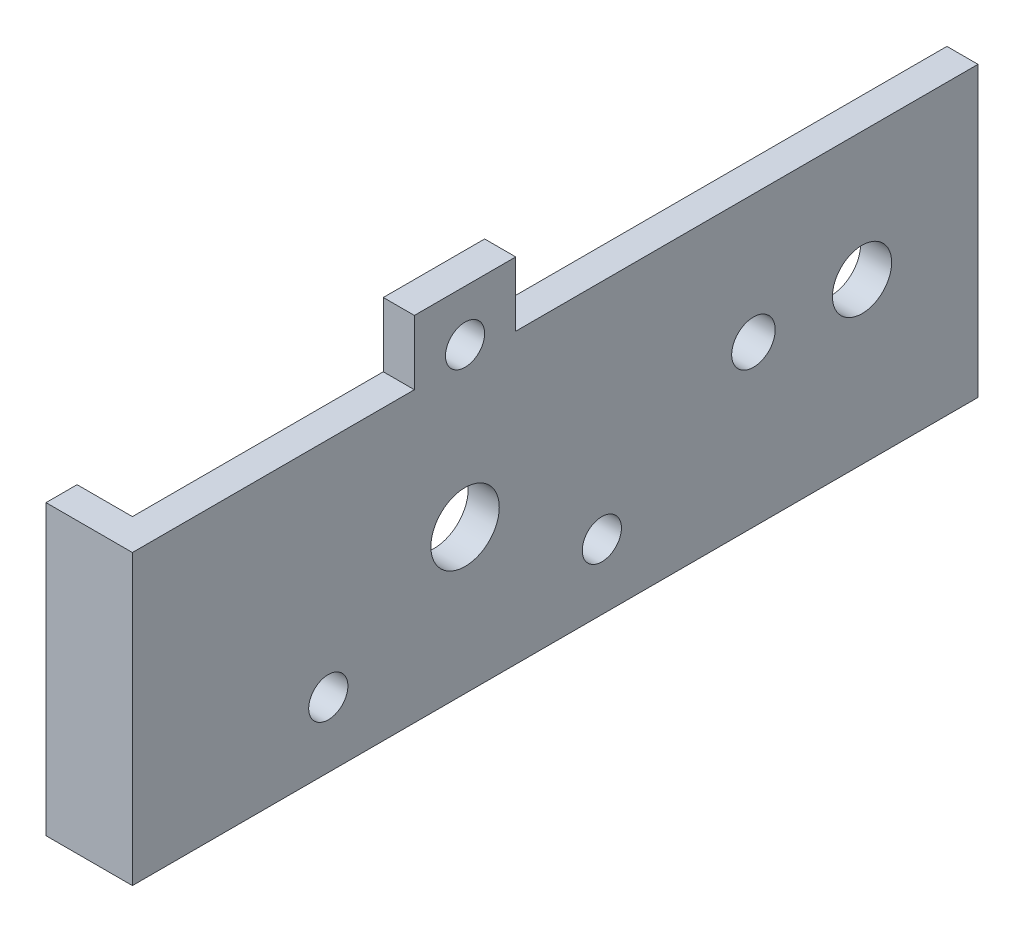
ISO-10303-21;
HEADER;
FILE_DESCRIPTION(('STEP AP214'),'2;1');
FILE_NAME('part.step','',(''),(''),'','','');
FILE_SCHEMA(('AUTOMOTIVE_DESIGN { 1 0 10303 214 1 1 1 1 }'));
ENDSEC;
DATA;
#1=APPLICATION_CONTEXT('core data for automotive mechanical design processes');
#2=APPLICATION_PROTOCOL_DEFINITION('international standard','automotive_design',2000,#1);
#3=PRODUCT_CONTEXT('',#1,'mechanical');
#4=PRODUCT('Part','Part','',(#3));
#5=PRODUCT_RELATED_PRODUCT_CATEGORY('part','',(#4));
#6=PRODUCT_DEFINITION_FORMATION('','',#4);
#7=PRODUCT_DEFINITION_CONTEXT('part definition',#1,'design');
#8=PRODUCT_DEFINITION('design','',#6,#7);
#9=PRODUCT_DEFINITION_SHAPE('','',#8);
#10=(LENGTH_UNIT() NAMED_UNIT(*) SI_UNIT(.MILLI.,.METRE.));
#11=(NAMED_UNIT(*) PLANE_ANGLE_UNIT() SI_UNIT($,.RADIAN.));
#12=(NAMED_UNIT(*) SI_UNIT($,.STERADIAN.) SOLID_ANGLE_UNIT());
#13=UNCERTAINTY_MEASURE_WITH_UNIT(LENGTH_MEASURE(1.E-05),#10,'distance_accuracy_value','');
#14=(GEOMETRIC_REPRESENTATION_CONTEXT(3) GLOBAL_UNCERTAINTY_ASSIGNED_CONTEXT((#13)) GLOBAL_UNIT_ASSIGNED_CONTEXT((#10,
#11,#12)) REPRESENTATION_CONTEXT('',''));
#15=CARTESIAN_POINT('',(0.,0.,0.));
#16=DIRECTION('',(0.,0.,1.));
#17=DIRECTION('',(1.,0.,0.));
#18=AXIS2_PLACEMENT_3D('',#15,#16,#17);
#19=CARTESIAN_POINT('',(13.9,70.2,-63.));
#20=DIRECTION('',(0.,-1.,0.));
#21=DIRECTION('',(0.,0.,-1.));
#22=AXIS2_PLACEMENT_3D('',#19,#20,#21);
#23=PLANE('',#22);
#24=DIRECTION('',(1.,0.,0.));
#25=VECTOR('',#24,1.);
#26=CARTESIAN_POINT('',(8.89999999999996,70.2,-108.35));
#27=LINE('',#26,#25);
#28=CARTESIAN_POINT('',(8.89999999999996,70.2,-108.35));
#29=VERTEX_POINT('',#28);
#30=CARTESIAN_POINT('',(13.9,70.2,-108.35));
#31=VERTEX_POINT('',#30);
#32=EDGE_CURVE('E215',#29,#31,#27,.T.);
#33=ORIENTED_EDGE('',*,*,#32,.F.);
#34=DIRECTION('',(0.,0.,1.));
#35=VECTOR('',#34,1.);
#36=CARTESIAN_POINT('',(8.9,70.2,-199.));
#37=LINE('',#36,#35);
#38=CARTESIAN_POINT('',(8.9,70.2,-68.));
#39=VERTEX_POINT('',#38);
#40=EDGE_CURVE('E238',#29,#39,#37,.T.);
#41=ORIENTED_EDGE('',*,*,#40,.T.);
#42=DIRECTION('',(-1.,0.,0.));
#43=VECTOR('',#42,1.);
#44=CARTESIAN_POINT('',(13.9,70.2,-68.));
#45=LINE('',#44,#43);
#46=CARTESIAN_POINT('',(0.,70.2,-68.));
#47=VERTEX_POINT('',#46);
#48=EDGE_CURVE('E269',#39,#47,#45,.T.);
#49=ORIENTED_EDGE('',*,*,#48,.T.);
#50=DIRECTION('',(0.,0.,1.));
#51=VECTOR('',#50,1.);
#52=CARTESIAN_POINT('',(0.,70.2,-63.));
#53=LINE('',#52,#51);
#54=CARTESIAN_POINT('',(0.,70.2,-63.));
#55=VERTEX_POINT('',#54);
#56=EDGE_CURVE('E251',#47,#55,#53,.T.);
#57=ORIENTED_EDGE('',*,*,#56,.T.);
#58=DIRECTION('',(-1.,0.,0.));
#59=VECTOR('',#58,1.);
#60=CARTESIAN_POINT('',(13.9,70.2,-63.));
#61=LINE('',#60,#59);
#62=CARTESIAN_POINT('',(13.9,70.2,-63.));
#63=VERTEX_POINT('',#62);
#64=EDGE_CURVE('E257',#63,#55,#61,.T.);
#65=ORIENTED_EDGE('',*,*,#64,.F.);
#66=DIRECTION('',(0.,0.,1.));
#67=VECTOR('',#66,1.);
#68=CARTESIAN_POINT('',(13.9,70.2,-63.));
#69=LINE('',#68,#67);
#70=EDGE_CURVE('E253',#31,#63,#69,.T.);
#71=ORIENTED_EDGE('',*,*,#70,.F.);
#72=EDGE_LOOP('',(#33,#41,#49,#57,#65,#71));
#73=FACE_BOUND('',#72,.T.);
#74=ADVANCED_FACE('F40',(#73),#23,.F.);
#75=CARTESIAN_POINT('',(13.9,70.2,-68.));
#76=DIRECTION('',(0.,0.,1.));
#77=DIRECTION('',(1.,0.,0.));
#78=AXIS2_PLACEMENT_3D('',#75,#76,#77);
#79=PLANE('',#78);
#80=DIRECTION('',(0.,1.,0.));
#81=VECTOR('',#80,1.);
#82=CARTESIAN_POINT('',(8.9,70.2,-68.));
#83=LINE('',#82,#81);
#84=CARTESIAN_POINT('',(8.9,23.8,-68.));
#85=VERTEX_POINT('',#84);
#86=EDGE_CURVE('E65',#85,#39,#83,.T.);
#87=ORIENTED_EDGE('',*,*,#86,.F.);
#88=DIRECTION('',(-1.,0.,0.));
#89=VECTOR('',#88,1.);
#90=CARTESIAN_POINT('',(13.9,23.8,-68.));
#91=LINE('',#90,#89);
#92=CARTESIAN_POINT('',(0.,23.8,-68.));
#93=VERTEX_POINT('',#92);
#94=EDGE_CURVE('E49',#85,#93,#91,.T.);
#95=ORIENTED_EDGE('',*,*,#94,.T.);
#96=DIRECTION('',(0.,1.,0.));
#97=VECTOR('',#96,1.);
#98=CARTESIAN_POINT('',(0.,70.2,-68.));
#99=LINE('',#98,#97);
#100=EDGE_CURVE('E263',#93,#47,#99,.T.);
#101=ORIENTED_EDGE('',*,*,#100,.T.);
#102=ORIENTED_EDGE('',*,*,#48,.F.);
#103=EDGE_LOOP('',(#87,#95,#101,#102));
#104=FACE_BOUND('',#103,.T.);
#105=ADVANCED_FACE('F295',(#104),#79,.F.);
#106=CARTESIAN_POINT('',(13.9,23.8,-63.));
#107=DIRECTION('',(0.,0.,-1.));
#108=DIRECTION('',(-1.,0.,0.));
#109=AXIS2_PLACEMENT_3D('',#106,#107,#108);
#110=PLANE('',#109);
#111=DIRECTION('',(0.,-1.,0.));
#112=VECTOR('',#111,1.);
#113=CARTESIAN_POINT('',(0.,23.8,-63.));
#114=LINE('',#113,#112);
#115=CARTESIAN_POINT('',(0.,23.8,-63.));
#116=VERTEX_POINT('',#115);
#117=EDGE_CURVE('E246',#55,#116,#114,.T.);
#118=ORIENTED_EDGE('',*,*,#117,.T.);
#119=DIRECTION('',(-1.,0.,0.));
#120=VECTOR('',#119,1.);
#121=CARTESIAN_POINT('',(13.9,23.8,-63.));
#122=LINE('',#121,#120);
#123=CARTESIAN_POINT('',(13.9,23.8,-63.));
#124=VERTEX_POINT('',#123);
#125=EDGE_CURVE('E11',#124,#116,#122,.T.);
#126=ORIENTED_EDGE('',*,*,#125,.F.);
#127=DIRECTION('',(0.,-1.,0.));
#128=VECTOR('',#127,1.);
#129=CARTESIAN_POINT('',(13.9,23.8,-63.));
#130=LINE('',#129,#128);
#131=EDGE_CURVE('E247',#63,#124,#130,.T.);
#132=ORIENTED_EDGE('',*,*,#131,.F.);
#133=ORIENTED_EDGE('',*,*,#64,.T.);
#134=EDGE_LOOP('',(#118,#126,#132,#133));
#135=FACE_BOUND('',#134,.T.);
#136=ADVANCED_FACE('F42',(#135),#110,.F.);
#137=CARTESIAN_POINT('',(13.9,23.8,-68.));
#138=DIRECTION('',(0.,1.,0.));
#139=DIRECTION('',(0.,0.,1.));
#140=AXIS2_PLACEMENT_3D('',#137,#138,#139);
#141=PLANE('',#140);
#142=DIRECTION('',(0.,0.,-1.));
#143=VECTOR('',#142,1.);
#144=CARTESIAN_POINT('',(0.,23.8,-68.));
#145=LINE('',#144,#143);
#146=EDGE_CURVE('E260',#116,#93,#145,.T.);
#147=ORIENTED_EDGE('',*,*,#146,.T.);
#148=ORIENTED_EDGE('',*,*,#94,.F.);
#149=DIRECTION('',(0.,0.,1.));
#150=VECTOR('',#149,1.);
#151=CARTESIAN_POINT('',(8.9,23.8,-199.));
#152=LINE('',#151,#150);
#153=CARTESIAN_POINT('',(8.9,23.8,-199.));
#154=VERTEX_POINT('',#153);
#155=EDGE_CURVE('E243',#154,#85,#152,.T.);
#156=ORIENTED_EDGE('',*,*,#155,.F.);
#157=DIRECTION('',(-1.,0.,0.));
#158=VECTOR('',#157,1.);
#159=CARTESIAN_POINT('',(13.9,23.8,-199.));
#160=LINE('',#159,#158);
#161=CARTESIAN_POINT('',(13.9,23.8,-199.));
#162=VERTEX_POINT('',#161);
#163=EDGE_CURVE('E231',#162,#154,#160,.T.);
#164=ORIENTED_EDGE('',*,*,#163,.F.);
#165=DIRECTION('',(0.,0.,-1.));
#166=VECTOR('',#165,1.);
#167=CARTESIAN_POINT('',(13.9,23.8,-68.));
#168=LINE('',#167,#166);
#169=EDGE_CURVE('E250',#124,#162,#168,.T.);
#170=ORIENTED_EDGE('',*,*,#169,.F.);
#171=ORIENTED_EDGE('',*,*,#125,.T.);
#172=EDGE_LOOP('',(#147,#148,#156,#164,#170,#171));
#173=FACE_BOUND('',#172,.T.);
#174=ADVANCED_FACE('F307',(#173),#141,.F.);
#175=CARTESIAN_POINT('',(8.9,70.2,-199.));
#176=VERTEX_POINT('',#175);
#177=CARTESIAN_POINT('',(8.89999999999995,70.2,-124.65));
#178=VERTEX_POINT('',#177);
#179=EDGE_CURVE('E240',#176,#178,#37,.T.);
#180=ORIENTED_EDGE('',*,*,#179,.T.);
#181=DIRECTION('',(1.,0.,0.));
#182=VECTOR('',#181,1.);
#183=CARTESIAN_POINT('',(8.89999999999995,70.2,-124.65));
#184=LINE('',#183,#182);
#185=CARTESIAN_POINT('',(13.9,70.2,-124.65));
#186=VERTEX_POINT('',#185);
#187=EDGE_CURVE('E225',#178,#186,#184,.T.);
#188=ORIENTED_EDGE('',*,*,#187,.T.);
#189=CARTESIAN_POINT('',(13.9,70.2,-199.));
#190=VERTEX_POINT('',#189);
#191=EDGE_CURVE('E254',#190,#186,#69,.T.);
#192=ORIENTED_EDGE('',*,*,#191,.F.);
#193=DIRECTION('',(1.,0.,0.));
#194=VECTOR('',#193,1.);
#195=CARTESIAN_POINT('',(13.9,70.2,-199.));
#196=LINE('',#195,#194);
#197=EDGE_CURVE('E235',#176,#190,#196,.T.);
#198=ORIENTED_EDGE('',*,*,#197,.F.);
#199=EDGE_LOOP('',(#180,#188,#192,#198));
#200=FACE_BOUND('',#199,.T.);
#201=ADVANCED_FACE('F298',(#200),#23,.F.);
#202=CARTESIAN_POINT('',(13.9,0.,0.));
#203=DIRECTION('',(-1.,0.,0.));
#204=DIRECTION('',(0.,0.,1.));
#205=AXIS2_PLACEMENT_3D('',#202,#203,#204);
#206=PLANE('',#205);
#207=CARTESIAN_POINT('',(13.8999999999999,49.5624999999999,-162.886026441855));
#208=DIRECTION('',(1.,0.,0.));
#209=DIRECTION('',(0.,0.,-1.));
#210=AXIS2_PLACEMENT_3D('',#207,#208,#209);
#211=CIRCLE('',#210,3.49999999999999);
#212=CARTESIAN_POINT('',(13.8999999999999,49.5624999999999,-166.386026441855));
#213=VERTEX_POINT('',#212);
#214=EDGE_CURVE('E174',#213,#213,#211,.T.);
#215=ORIENTED_EDGE('',*,*,#214,.F.);
#216=EDGE_LOOP('',(#215));
#217=FACE_BOUND('',#216,.T.);
#218=CARTESIAN_POINT('',(13.8999999999999,49.5625,-180.348526441855));
#219=DIRECTION('',(1.,0.,0.));
#220=DIRECTION('',(0.,0.,-1.));
#221=AXIS2_PLACEMENT_3D('',#218,#219,#220);
#222=CIRCLE('',#221,4.76250000000001);
#223=CARTESIAN_POINT('',(13.8999999999999,49.5625,-185.111026441855));
#224=VERTEX_POINT('',#223);
#225=EDGE_CURVE('E177',#224,#224,#222,.T.);
#226=ORIENTED_EDGE('',*,*,#225,.F.);
#227=EDGE_LOOP('',(#226));
#228=FACE_BOUND('',#227,.T.);
#229=CARTESIAN_POINT('',(13.9,34.3,-94.5029547438753));
#230=DIRECTION('',(1.,0.,0.));
#231=DIRECTION('',(0.,0.,-1.));
#232=AXIS2_PLACEMENT_3D('',#229,#230,#231);
#233=CIRCLE('',#232,3.14999999999998);
#234=CARTESIAN_POINT('',(13.9,34.3,-97.6529547438752));
#235=VERTEX_POINT('',#234);
#236=EDGE_CURVE('E197',#235,#235,#233,.T.);
#237=ORIENTED_EDGE('',*,*,#236,.F.);
#238=EDGE_LOOP('',(#237));
#239=FACE_BOUND('',#238,.T.);
#240=CARTESIAN_POINT('',(13.8999999999999,34.3,-138.497045256125));
#241=DIRECTION('',(1.,0.,0.));
#242=DIRECTION('',(0.,0.,-1.));
#243=AXIS2_PLACEMENT_3D('',#240,#241,#242);
#244=CIRCLE('',#243,3.14999999999998);
#245=CARTESIAN_POINT('',(13.8999999999999,34.3,-141.647045256125));
#246=VERTEX_POINT('',#245);
#247=EDGE_CURVE('E191',#246,#246,#244,.T.);
#248=ORIENTED_EDGE('',*,*,#247,.F.);
#249=EDGE_LOOP('',(#248));
#250=FACE_BOUND('',#249,.T.);
#251=CARTESIAN_POINT('',(13.9,72.4,-116.5));
#252=DIRECTION('',(1.,0.,0.));
#253=DIRECTION('',(0.,0.,-1.));
#254=AXIS2_PLACEMENT_3D('',#251,#252,#253);
#255=CIRCLE('',#254,3.14999999999999);
#256=CARTESIAN_POINT('',(13.9,72.4,-119.65));
#257=VERTEX_POINT('',#256);
#258=EDGE_CURVE('E185',#257,#257,#255,.T.);
#259=ORIENTED_EDGE('',*,*,#258,.F.);
#260=EDGE_LOOP('',(#259));
#261=FACE_BOUND('',#260,.T.);
#262=CARTESIAN_POINT('',(13.9,47.,-116.5));
#263=DIRECTION('',(1.,0.,0.));
#264=DIRECTION('',(0.,0.,-1.));
#265=AXIS2_PLACEMENT_3D('',#262,#263,#264);
#266=CIRCLE('',#265,5.50000000000002);
#267=CARTESIAN_POINT('',(13.9,47.,-122.));
#268=VERTEX_POINT('',#267);
#269=EDGE_CURVE('E184',#268,#268,#266,.T.);
#270=ORIENTED_EDGE('',*,*,#269,.F.);
#271=EDGE_LOOP('',(#270));
#272=FACE_BOUND('',#271,.T.);
#273=ORIENTED_EDGE('',*,*,#131,.T.);
#274=ORIENTED_EDGE('',*,*,#169,.T.);
#275=DIRECTION('',(0.,-1.,0.));
#276=VECTOR('',#275,1.);
#277=CARTESIAN_POINT('',(13.9,70.2,-199.));
#278=LINE('',#277,#276);
#279=EDGE_CURVE('E228',#190,#162,#278,.T.);
#280=ORIENTED_EDGE('',*,*,#279,.F.);
#281=ORIENTED_EDGE('',*,*,#191,.T.);
#282=DIRECTION('',(0.,1.,0.));
#283=VECTOR('',#282,1.);
#284=CARTESIAN_POINT('',(13.9,70.2,-124.65));
#285=LINE('',#284,#283);
#286=CARTESIAN_POINT('',(13.9,80.55,-124.65));
#287=VERTEX_POINT('',#286);
#288=EDGE_CURVE('E57',#186,#287,#285,.T.);
#289=ORIENTED_EDGE('',*,*,#288,.T.);
#290=DIRECTION('',(0.,0.,1.));
#291=VECTOR('',#290,1.);
#292=CARTESIAN_POINT('',(13.9,80.55,-124.65));
#293=LINE('',#292,#291);
#294=CARTESIAN_POINT('',(13.9,80.55,-108.35));
#295=VERTEX_POINT('',#294);
#296=EDGE_CURVE('E209',#287,#295,#293,.T.);
#297=ORIENTED_EDGE('',*,*,#296,.T.);
#298=DIRECTION('',(0.,-1.,0.));
#299=VECTOR('',#298,1.);
#300=CARTESIAN_POINT('',(13.9,80.55,-108.35));
#301=LINE('',#300,#299);
#302=EDGE_CURVE('E203',#295,#31,#301,.T.);
#303=ORIENTED_EDGE('',*,*,#302,.T.);
#304=ORIENTED_EDGE('',*,*,#70,.T.);
#305=EDGE_LOOP('',(#273,#274,#280,#281,#289,#297,#303,#304));
#306=FACE_BOUND('',#305,.T.);
#307=ADVANCED_FACE('F306',(#217,#228,#239,#250,#261,#272,#306),#206,.F.);
#308=CARTESIAN_POINT('',(0.,0.,0.));
#309=DIRECTION('',(-1.,0.,0.));
#310=DIRECTION('',(0.,0.,1.));
#311=AXIS2_PLACEMENT_3D('',#308,#309,#310);
#312=PLANE('',#311);
#313=CARTESIAN_POINT('',(0.,62.,-65.5));
#314=DIRECTION('',(-1.,0.,0.));
#315=DIRECTION('',(0.,0.,1.));
#316=AXIS2_PLACEMENT_3D('',#313,#314,#315);
#317=CIRCLE('',#316,1.27500000000001);
#318=CARTESIAN_POINT('',(0.,62.,-64.225));
#319=VERTEX_POINT('',#318);
#320=EDGE_CURVE('E147',#319,#319,#317,.T.);
#321=ORIENTED_EDGE('',*,*,#320,.F.);
#322=EDGE_LOOP('',(#321));
#323=FACE_BOUND('',#322,.T.);
#324=CARTESIAN_POINT('',(0.,52.,-65.5));
#325=DIRECTION('',(-1.,0.,0.));
#326=DIRECTION('',(0.,0.,1.));
#327=AXIS2_PLACEMENT_3D('',#324,#325,#326);
#328=CIRCLE('',#327,1.275);
#329=CARTESIAN_POINT('',(0.,52.,-64.225));
#330=VERTEX_POINT('',#329);
#331=EDGE_CURVE('E140',#330,#330,#328,.T.);
#332=ORIENTED_EDGE('',*,*,#331,.F.);
#333=EDGE_LOOP('',(#332));
#334=FACE_BOUND('',#333,.T.);
#335=CARTESIAN_POINT('',(0.,32.,-65.5));
#336=DIRECTION('',(-1.,0.,0.));
#337=DIRECTION('',(0.,0.,1.));
#338=AXIS2_PLACEMENT_3D('',#335,#336,#337);
#339=CIRCLE('',#338,1.275);
#340=CARTESIAN_POINT('',(0.,32.,-64.225));
#341=VERTEX_POINT('',#340);
#342=EDGE_CURVE('E156',#341,#341,#339,.T.);
#343=ORIENTED_EDGE('',*,*,#342,.F.);
#344=EDGE_LOOP('',(#343));
#345=FACE_BOUND('',#344,.T.);
#346=CARTESIAN_POINT('',(0.,42.,-65.5));
#347=DIRECTION('',(-1.,0.,0.));
#348=DIRECTION('',(0.,0.,1.));
#349=AXIS2_PLACEMENT_3D('',#346,#347,#348);
#350=CIRCLE('',#349,1.275);
#351=CARTESIAN_POINT('',(0.,42.,-64.225));
#352=VERTEX_POINT('',#351);
#353=EDGE_CURVE('E165',#352,#352,#350,.T.);
#354=ORIENTED_EDGE('',*,*,#353,.F.);
#355=EDGE_LOOP('',(#354));
#356=FACE_BOUND('',#355,.T.);
#357=ORIENTED_EDGE('',*,*,#117,.F.);
#358=ORIENTED_EDGE('',*,*,#56,.F.);
#359=ORIENTED_EDGE('',*,*,#100,.F.);
#360=ORIENTED_EDGE('',*,*,#146,.F.);
#361=EDGE_LOOP('',(#357,#358,#359,#360));
#362=FACE_BOUND('',#361,.T.);
#363=ADVANCED_FACE('F313',(#323,#334,#345,#356,#362),#312,.T.);
#364=CARTESIAN_POINT('',(8.9,70.2,-199.));
#365=DIRECTION('',(1.,0.,0.));
#366=DIRECTION('',(0.,1.,0.));
#367=AXIS2_PLACEMENT_3D('',#364,#365,#366);
#368=PLANE('',#367);
#369=CARTESIAN_POINT('',(8.9,49.5624999999999,-162.886026441855));
#370=DIRECTION('',(1.,0.,0.));
#371=DIRECTION('',(0.,1.,0.));
#372=AXIS2_PLACEMENT_3D('',#369,#370,#371);
#373=CIRCLE('',#372,3.49999999999999);
#374=CARTESIAN_POINT('',(8.9,53.0624999999998,-162.886026441855));
#375=VERTEX_POINT('',#374);
#376=EDGE_CURVE('E44',#375,#375,#373,.T.);
#377=ORIENTED_EDGE('',*,*,#376,.T.);
#378=EDGE_LOOP('',(#377));
#379=FACE_BOUND('',#378,.T.);
#380=CARTESIAN_POINT('',(8.9,49.5625,-180.348526441855));
#381=DIRECTION('',(1.,0.,0.));
#382=DIRECTION('',(0.,1.,0.));
#383=AXIS2_PLACEMENT_3D('',#380,#381,#382);
#384=CIRCLE('',#383,4.76250000000001);
#385=CARTESIAN_POINT('',(8.9,54.325,-180.348526441855));
#386=VERTEX_POINT('',#385);
#387=EDGE_CURVE('E180',#386,#386,#384,.T.);
#388=ORIENTED_EDGE('',*,*,#387,.T.);
#389=EDGE_LOOP('',(#388));
#390=FACE_BOUND('',#389,.T.);
#391=CARTESIAN_POINT('',(8.89999999999996,34.3,-94.5029547438753));
#392=DIRECTION('',(1.,0.,0.));
#393=DIRECTION('',(0.,0.,-1.));
#394=AXIS2_PLACEMENT_3D('',#391,#392,#393);
#395=CIRCLE('',#394,3.14999999999998);
#396=CARTESIAN_POINT('',(8.89999999999996,34.3,-97.6529547438752));
#397=VERTEX_POINT('',#396);
#398=EDGE_CURVE('E194',#397,#397,#395,.T.);
#399=ORIENTED_EDGE('',*,*,#398,.T.);
#400=EDGE_LOOP('',(#399));
#401=FACE_BOUND('',#400,.T.);
#402=CARTESIAN_POINT('',(8.89999999999995,34.3,-138.497045256125));
#403=DIRECTION('',(1.,0.,0.));
#404=DIRECTION('',(0.,0.,-1.));
#405=AXIS2_PLACEMENT_3D('',#402,#403,#404);
#406=CIRCLE('',#405,3.14999999999998);
#407=CARTESIAN_POINT('',(8.89999999999995,34.3,-141.647045256125));
#408=VERTEX_POINT('',#407);
#409=EDGE_CURVE('E188',#408,#408,#406,.T.);
#410=ORIENTED_EDGE('',*,*,#409,.T.);
#411=EDGE_LOOP('',(#410));
#412=FACE_BOUND('',#411,.T.);
#413=CARTESIAN_POINT('',(8.89999999999996,72.4,-116.5));
#414=DIRECTION('',(1.,0.,0.));
#415=DIRECTION('',(0.,0.,-1.));
#416=AXIS2_PLACEMENT_3D('',#413,#414,#415);
#417=CIRCLE('',#416,3.14999999999999);
#418=CARTESIAN_POINT('',(8.89999999999995,72.4,-119.65));
#419=VERTEX_POINT('',#418);
#420=EDGE_CURVE('E181',#419,#419,#417,.T.);
#421=ORIENTED_EDGE('',*,*,#420,.T.);
#422=EDGE_LOOP('',(#421));
#423=FACE_BOUND('',#422,.T.);
#424=CARTESIAN_POINT('',(8.89999999999996,47.,-116.5));
#425=DIRECTION('',(1.,0.,0.));
#426=DIRECTION('',(0.,0.,-1.));
#427=AXIS2_PLACEMENT_3D('',#424,#425,#426);
#428=CIRCLE('',#427,5.50000000000002);
#429=CARTESIAN_POINT('',(8.89999999999995,47.,-122.));
#430=VERTEX_POINT('',#429);
#431=EDGE_CURVE('E200',#430,#430,#428,.T.);
#432=ORIENTED_EDGE('',*,*,#431,.T.);
#433=EDGE_LOOP('',(#432));
#434=FACE_BOUND('',#433,.T.);
#435=ORIENTED_EDGE('',*,*,#86,.T.);
#436=ORIENTED_EDGE('',*,*,#40,.F.);
#437=DIRECTION('',(0.,-1.,0.));
#438=VECTOR('',#437,1.);
#439=CARTESIAN_POINT('',(8.89999999999996,80.55,-108.35));
#440=LINE('',#439,#438);
#441=CARTESIAN_POINT('',(8.89999999999996,80.55,-108.35));
#442=VERTEX_POINT('',#441);
#443=EDGE_CURVE('E206',#442,#29,#440,.T.);
#444=ORIENTED_EDGE('',*,*,#443,.F.);
#445=DIRECTION('',(0.,0.,1.));
#446=VECTOR('',#445,1.);
#447=CARTESIAN_POINT('',(8.89999999999995,80.55,-124.65));
#448=LINE('',#447,#446);
#449=CARTESIAN_POINT('',(8.89999999999995,80.55,-124.65));
#450=VERTEX_POINT('',#449);
#451=EDGE_CURVE('E212',#450,#442,#448,.T.);
#452=ORIENTED_EDGE('',*,*,#451,.F.);
#453=DIRECTION('',(0.,1.,0.));
#454=VECTOR('',#453,1.);
#455=CARTESIAN_POINT('',(8.89999999999995,70.2,-124.65));
#456=LINE('',#455,#454);
#457=EDGE_CURVE('E208',#178,#450,#456,.T.);
#458=ORIENTED_EDGE('',*,*,#457,.F.);
#459=ORIENTED_EDGE('',*,*,#179,.F.);
#460=DIRECTION('',(0.,1.,0.));
#461=VECTOR('',#460,1.);
#462=CARTESIAN_POINT('',(8.9,70.2,-199.));
#463=LINE('',#462,#461);
#464=EDGE_CURVE('E233',#154,#176,#463,.T.);
#465=ORIENTED_EDGE('',*,*,#464,.F.);
#466=ORIENTED_EDGE('',*,*,#155,.T.);
#467=EDGE_LOOP('',(#435,#436,#444,#452,#458,#459,#465,#466));
#468=FACE_BOUND('',#467,.T.);
#469=ADVANCED_FACE('F274',(#379,#390,#401,#412,#423,#434,#468),#368,.F.);
#470=CARTESIAN_POINT('',(0.,0.,-199.));
#471=DIRECTION('',(0.,0.,-1.));
#472=DIRECTION('',(-1.,0.,0.));
#473=AXIS2_PLACEMENT_3D('',#470,#471,#472);
#474=PLANE('',#473);
#475=ORIENTED_EDGE('',*,*,#279,.T.);
#476=ORIENTED_EDGE('',*,*,#163,.T.);
#477=ORIENTED_EDGE('',*,*,#464,.T.);
#478=ORIENTED_EDGE('',*,*,#197,.T.);
#479=EDGE_LOOP('',(#475,#476,#477,#478));
#480=FACE_BOUND('',#479,.T.);
#481=ADVANCED_FACE('F344',(#480),#474,.T.);
#482=CARTESIAN_POINT('',(8.89999999999996,80.55,-108.35));
#483=DIRECTION('',(0.,0.,1.));
#484=DIRECTION('',(1.,0.,0.));
#485=AXIS2_PLACEMENT_3D('',#482,#483,#484);
#486=PLANE('',#485);
#487=ORIENTED_EDGE('',*,*,#302,.F.);
#488=DIRECTION('',(1.,0.,0.));
#489=VECTOR('',#488,1.);
#490=CARTESIAN_POINT('',(8.89999999999996,80.55,-108.35));
#491=LINE('',#490,#489);
#492=EDGE_CURVE('E221',#442,#295,#491,.T.);
#493=ORIENTED_EDGE('',*,*,#492,.F.);
#494=ORIENTED_EDGE('',*,*,#443,.T.);
#495=ORIENTED_EDGE('',*,*,#32,.T.);
#496=EDGE_LOOP('',(#487,#493,#494,#495));
#497=FACE_BOUND('',#496,.T.);
#498=ADVANCED_FACE('F332',(#497),#486,.T.);
#499=CARTESIAN_POINT('',(8.89999999999995,80.55,-124.65));
#500=DIRECTION('',(0.,1.,0.));
#501=DIRECTION('',(0.,0.,1.));
#502=AXIS2_PLACEMENT_3D('',#499,#500,#501);
#503=PLANE('',#502);
#504=ORIENTED_EDGE('',*,*,#296,.F.);
#505=DIRECTION('',(1.,0.,0.));
#506=VECTOR('',#505,1.);
#507=CARTESIAN_POINT('',(8.89999999999995,80.55,-124.65));
#508=LINE('',#507,#506);
#509=EDGE_CURVE('E223',#450,#287,#508,.T.);
#510=ORIENTED_EDGE('',*,*,#509,.F.);
#511=ORIENTED_EDGE('',*,*,#451,.T.);
#512=ORIENTED_EDGE('',*,*,#492,.T.);
#513=EDGE_LOOP('',(#504,#510,#511,#512));
#514=FACE_BOUND('',#513,.T.);
#515=ADVANCED_FACE('F329',(#514),#503,.T.);
#516=CARTESIAN_POINT('',(8.89999999999995,70.2,-124.65));
#517=DIRECTION('',(0.,0.,-1.));
#518=DIRECTION('',(-1.,0.,0.));
#519=AXIS2_PLACEMENT_3D('',#516,#517,#518);
#520=PLANE('',#519);
#521=ORIENTED_EDGE('',*,*,#288,.F.);
#522=ORIENTED_EDGE('',*,*,#187,.F.);
#523=ORIENTED_EDGE('',*,*,#457,.T.);
#524=ORIENTED_EDGE('',*,*,#509,.T.);
#525=EDGE_LOOP('',(#521,#522,#523,#524));
#526=FACE_BOUND('',#525,.T.);
#527=ADVANCED_FACE('F324',(#526),#520,.T.);
#528=CARTESIAN_POINT('',(8.89999999999996,47.,-116.5));
#529=DIRECTION('',(1.,0.,0.));
#530=DIRECTION('',(0.,0.,-1.));
#531=AXIS2_PLACEMENT_3D('',#528,#529,#530);
#532=CYLINDRICAL_SURFACE('',#531,5.50000000000002);
#533=ORIENTED_EDGE('',*,*,#431,.F.);
#534=EDGE_LOOP('',(#533));
#535=FACE_BOUND('',#534,.T.);
#536=ORIENTED_EDGE('',*,*,#269,.T.);
#537=EDGE_LOOP('',(#536));
#538=FACE_BOUND('',#537,.T.);
#539=ADVANCED_FACE('F535',(#535,#538),#532,.F.);
#540=CARTESIAN_POINT('',(8.89999999999996,72.4,-116.5));
#541=DIRECTION('',(1.,0.,0.));
#542=DIRECTION('',(0.,0.,-1.));
#543=AXIS2_PLACEMENT_3D('',#540,#541,#542);
#544=CYLINDRICAL_SURFACE('',#543,3.14999999999999);
#545=ORIENTED_EDGE('',*,*,#420,.F.);
#546=EDGE_LOOP('',(#545));
#547=FACE_BOUND('',#546,.T.);
#548=ORIENTED_EDGE('',*,*,#258,.T.);
#549=EDGE_LOOP('',(#548));
#550=FACE_BOUND('',#549,.T.);
#551=ADVANCED_FACE('F526',(#547,#550),#544,.F.);
#552=CARTESIAN_POINT('',(8.89999999999995,34.3,-138.497045256125));
#553=DIRECTION('',(1.,0.,0.));
#554=DIRECTION('',(0.,0.,-1.));
#555=AXIS2_PLACEMENT_3D('',#552,#553,#554);
#556=CYLINDRICAL_SURFACE('',#555,3.14999999999998);
#557=ORIENTED_EDGE('',*,*,#409,.F.);
#558=EDGE_LOOP('',(#557));
#559=FACE_BOUND('',#558,.T.);
#560=ORIENTED_EDGE('',*,*,#247,.T.);
#561=EDGE_LOOP('',(#560));
#562=FACE_BOUND('',#561,.T.);
#563=ADVANCED_FACE('F290',(#559,#562),#556,.F.);
#564=CARTESIAN_POINT('',(8.89999999999996,34.3,-94.5029547438753));
#565=DIRECTION('',(1.,0.,0.));
#566=DIRECTION('',(0.,0.,-1.));
#567=AXIS2_PLACEMENT_3D('',#564,#565,#566);
#568=CYLINDRICAL_SURFACE('',#567,3.14999999999998);
#569=ORIENTED_EDGE('',*,*,#398,.F.);
#570=EDGE_LOOP('',(#569));
#571=FACE_BOUND('',#570,.T.);
#572=ORIENTED_EDGE('',*,*,#236,.T.);
#573=EDGE_LOOP('',(#572));
#574=FACE_BOUND('',#573,.T.);
#575=ADVANCED_FACE('F280',(#571,#574),#568,.F.);
#576=CARTESIAN_POINT('',(4.89999999999993,49.5625,-180.348526441855));
#577=DIRECTION('',(1.,0.,0.));
#578=DIRECTION('',(0.,0.,-1.));
#579=AXIS2_PLACEMENT_3D('',#576,#577,#578);
#580=CYLINDRICAL_SURFACE('',#579,4.76250000000001);
#581=ORIENTED_EDGE('',*,*,#225,.T.);
#582=EDGE_LOOP('',(#581));
#583=FACE_BOUND('',#582,.T.);
#584=ORIENTED_EDGE('',*,*,#387,.F.);
#585=EDGE_LOOP('',(#584));
#586=FACE_BOUND('',#585,.T.);
#587=ADVANCED_FACE('F277',(#583,#586),#580,.F.);
#588=CARTESIAN_POINT('',(4.89999999999994,49.5624999999999,-162.886026441855));
#589=DIRECTION('',(1.,0.,0.));
#590=DIRECTION('',(0.,0.,-1.));
#591=AXIS2_PLACEMENT_3D('',#588,#589,#590);
#592=CYLINDRICAL_SURFACE('',#591,3.49999999999999);
#593=ORIENTED_EDGE('',*,*,#214,.T.);
#594=EDGE_LOOP('',(#593));
#595=FACE_BOUND('',#594,.T.);
#596=ORIENTED_EDGE('',*,*,#376,.F.);
#597=EDGE_LOOP('',(#596));
#598=FACE_BOUND('',#597,.T.);
#599=ADVANCED_FACE('F279',(#595,#598),#592,.F.);
#600=CARTESIAN_POINT('',(12.5,42.,-65.5));
#601=DIRECTION('',(-1.,0.,0.));
#602=DIRECTION('',(0.,0.,1.));
#603=AXIS2_PLACEMENT_3D('',#600,#601,#602);
#604=CONICAL_SURFACE('',#603,1.025,1.02974425867665);
#605=CARTESIAN_POINT('',(13.1158821345033,42.,-65.5));
#606=VERTEX_POINT('',#605);
#607=VERTEX_LOOP('',#606);
#608=FACE_BOUND('',#607,.T.);
#609=CARTESIAN_POINT('',(12.5,42.,-65.5));
#610=DIRECTION('',(-1.,0.,0.));
#611=DIRECTION('',(0.,0.,1.));
#612=AXIS2_PLACEMENT_3D('',#609,#610,#611);
#613=CIRCLE('',#612,1.025);
#614=CARTESIAN_POINT('',(12.5,42.,-64.475));
#615=VERTEX_POINT('',#614);
#616=EDGE_CURVE('E171',#615,#615,#613,.T.);
#617=ORIENTED_EDGE('',*,*,#616,.T.);
#618=EDGE_LOOP('',(#617));
#619=FACE_BOUND('',#618,.T.);
#620=ADVANCED_FACE('F287',(#608,#619),#604,.F.);
#621=CARTESIAN_POINT('',(0.,42.,-65.5));
#622=DIRECTION('',(-1.,0.,0.));
#623=DIRECTION('',(0.,0.,1.));
#624=AXIS2_PLACEMENT_3D('',#621,#622,#623);
#625=CYLINDRICAL_SURFACE('',#624,1.025);
#626=ORIENTED_EDGE('',*,*,#616,.F.);
#627=EDGE_LOOP('',(#626));
#628=FACE_BOUND('',#627,.T.);
#629=CARTESIAN_POINT('',(0.25,42.,-65.5));
#630=DIRECTION('',(-1.,0.,0.));
#631=DIRECTION('',(0.,0.,1.));
#632=AXIS2_PLACEMENT_3D('',#629,#630,#631);
#633=CIRCLE('',#632,1.025);
#634=CARTESIAN_POINT('',(0.25,42.,-64.475));
#635=VERTEX_POINT('',#634);
#636=EDGE_CURVE('E168',#635,#635,#633,.T.);
#637=ORIENTED_EDGE('',*,*,#636,.T.);
#638=EDGE_LOOP('',(#637));
#639=FACE_BOUND('',#638,.T.);
#640=ADVANCED_FACE('F373',(#628,#639),#625,.F.);
#641=CARTESIAN_POINT('',(0.,42.,-65.5));
#642=DIRECTION('',(-1.,0.,0.));
#643=DIRECTION('',(0.,0.,1.));
#644=AXIS2_PLACEMENT_3D('',#641,#642,#643);
#645=CONICAL_SURFACE('',#644,1.275,0.785398163397445);
#646=ORIENTED_EDGE('',*,*,#636,.F.);
#647=EDGE_LOOP('',(#646));
#648=FACE_BOUND('',#647,.T.);
#649=ORIENTED_EDGE('',*,*,#353,.T.);
#650=EDGE_LOOP('',(#649));
#651=FACE_BOUND('',#650,.T.);
#652=ADVANCED_FACE('F370',(#648,#651),#645,.F.);
#653=CARTESIAN_POINT('',(12.5,32.,-65.5));
#654=DIRECTION('',(-1.,0.,0.));
#655=DIRECTION('',(0.,0.,1.));
#656=AXIS2_PLACEMENT_3D('',#653,#654,#655);
#657=CONICAL_SURFACE('',#656,1.025,1.02974425867665);
#658=CARTESIAN_POINT('',(13.1158821345033,32.,-65.5));
#659=VERTEX_POINT('',#658);
#660=VERTEX_LOOP('',#659);
#661=FACE_BOUND('',#660,.T.);
#662=CARTESIAN_POINT('',(12.5,32.,-65.5));
#663=DIRECTION('',(-1.,0.,0.));
#664=DIRECTION('',(0.,0.,1.));
#665=AXIS2_PLACEMENT_3D('',#662,#663,#664);
#666=CIRCLE('',#665,1.025);
#667=CARTESIAN_POINT('',(12.5,32.,-64.475));
#668=VERTEX_POINT('',#667);
#669=EDGE_CURVE('E162',#668,#668,#666,.T.);
#670=ORIENTED_EDGE('',*,*,#669,.T.);
#671=EDGE_LOOP('',(#670));
#672=FACE_BOUND('',#671,.T.);
#673=ADVANCED_FACE('F372',(#661,#672),#657,.F.);
#674=CARTESIAN_POINT('',(0.,32.,-65.5));
#675=DIRECTION('',(-1.,0.,0.));
#676=DIRECTION('',(0.,0.,1.));
#677=AXIS2_PLACEMENT_3D('',#674,#675,#676);
#678=CYLINDRICAL_SURFACE('',#677,1.025);
#679=ORIENTED_EDGE('',*,*,#669,.F.);
#680=EDGE_LOOP('',(#679));
#681=FACE_BOUND('',#680,.T.);
#682=CARTESIAN_POINT('',(0.25,32.,-65.5));
#683=DIRECTION('',(-1.,0.,0.));
#684=DIRECTION('',(0.,0.,1.));
#685=AXIS2_PLACEMENT_3D('',#682,#683,#684);
#686=CIRCLE('',#685,1.025);
#687=CARTESIAN_POINT('',(0.25,32.,-64.475));
#688=VERTEX_POINT('',#687);
#689=EDGE_CURVE('E159',#688,#688,#686,.T.);
#690=ORIENTED_EDGE('',*,*,#689,.T.);
#691=EDGE_LOOP('',(#690));
#692=FACE_BOUND('',#691,.T.);
#693=ADVANCED_FACE('F380',(#681,#692),#678,.F.);
#694=CARTESIAN_POINT('',(0.,32.,-65.5));
#695=DIRECTION('',(-1.,0.,0.));
#696=DIRECTION('',(0.,0.,1.));
#697=AXIS2_PLACEMENT_3D('',#694,#695,#696);
#698=CONICAL_SURFACE('',#697,1.275,0.785398163397445);
#699=ORIENTED_EDGE('',*,*,#689,.F.);
#700=EDGE_LOOP('',(#699));
#701=FACE_BOUND('',#700,.T.);
#702=ORIENTED_EDGE('',*,*,#342,.T.);
#703=EDGE_LOOP('',(#702));
#704=FACE_BOUND('',#703,.T.);
#705=ADVANCED_FACE('F410',(#701,#704),#698,.F.);
#706=CARTESIAN_POINT('',(12.5,52.,-65.5));
#707=DIRECTION('',(-1.,0.,0.));
#708=DIRECTION('',(0.,0.,1.));
#709=AXIS2_PLACEMENT_3D('',#706,#707,#708);
#710=CONICAL_SURFACE('',#709,1.025,1.02974425867665);
#711=CARTESIAN_POINT('',(13.1158821345033,52.,-65.5));
#712=VERTEX_POINT('',#711);
#713=VERTEX_LOOP('',#712);
#714=FACE_BOUND('',#713,.T.);
#715=CARTESIAN_POINT('',(12.5,52.,-65.5));
#716=DIRECTION('',(-1.,0.,0.));
#717=DIRECTION('',(0.,0.,1.));
#718=AXIS2_PLACEMENT_3D('',#715,#716,#717);
#719=CIRCLE('',#718,1.025);
#720=CARTESIAN_POINT('',(12.5,52.,-64.475));
#721=VERTEX_POINT('',#720);
#722=EDGE_CURVE('E153',#721,#721,#719,.T.);
#723=ORIENTED_EDGE('',*,*,#722,.T.);
#724=EDGE_LOOP('',(#723));
#725=FACE_BOUND('',#724,.T.);
#726=ADVANCED_FACE('F421',(#714,#725),#710,.F.);
#727=CARTESIAN_POINT('',(0.,52.,-65.5));
#728=DIRECTION('',(-1.,0.,0.));
#729=DIRECTION('',(0.,0.,1.));
#730=AXIS2_PLACEMENT_3D('',#727,#728,#729);
#731=CYLINDRICAL_SURFACE('',#730,1.025);
#732=ORIENTED_EDGE('',*,*,#722,.F.);
#733=EDGE_LOOP('',(#732));
#734=FACE_BOUND('',#733,.T.);
#735=CARTESIAN_POINT('',(0.25,52.,-65.5));
#736=DIRECTION('',(-1.,0.,0.));
#737=DIRECTION('',(0.,0.,1.));
#738=AXIS2_PLACEMENT_3D('',#735,#736,#737);
#739=CIRCLE('',#738,1.025);
#740=CARTESIAN_POINT('',(0.25,52.,-64.475));
#741=VERTEX_POINT('',#740);
#742=EDGE_CURVE('E144',#741,#741,#739,.T.);
#743=ORIENTED_EDGE('',*,*,#742,.T.);
#744=EDGE_LOOP('',(#743));
#745=FACE_BOUND('',#744,.T.);
#746=ADVANCED_FACE('F417',(#734,#745),#731,.F.);
#747=CARTESIAN_POINT('',(0.,52.,-65.5));
#748=DIRECTION('',(-1.,0.,0.));
#749=DIRECTION('',(0.,0.,1.));
#750=AXIS2_PLACEMENT_3D('',#747,#748,#749);
#751=CONICAL_SURFACE('',#750,1.275,0.785398163397445);
#752=ORIENTED_EDGE('',*,*,#742,.F.);
#753=EDGE_LOOP('',(#752));
#754=FACE_BOUND('',#753,.T.);
#755=ORIENTED_EDGE('',*,*,#331,.T.);
#756=EDGE_LOOP('',(#755));
#757=FACE_BOUND('',#756,.T.);
#758=ADVANCED_FACE('F134',(#754,#757),#751,.F.);
#759=CARTESIAN_POINT('',(12.5,62.,-65.5));
#760=DIRECTION('',(-1.,0.,0.));
#761=DIRECTION('',(0.,0.,1.));
#762=AXIS2_PLACEMENT_3D('',#759,#760,#761);
#763=CONICAL_SURFACE('',#762,1.02499999999999,1.02974425867665);
#764=CARTESIAN_POINT('',(13.1158821345033,62.,-65.5));
#765=VERTEX_POINT('',#764);
#766=VERTEX_LOOP('',#765);
#767=FACE_BOUND('',#766,.T.);
#768=CARTESIAN_POINT('',(12.5,62.,-65.5));
#769=DIRECTION('',(-1.,0.,0.));
#770=DIRECTION('',(0.,0.,1.));
#771=AXIS2_PLACEMENT_3D('',#768,#769,#770);
#772=CIRCLE('',#771,1.02499999999999);
#773=CARTESIAN_POINT('',(12.5,62.,-64.475));
#774=VERTEX_POINT('',#773);
#775=EDGE_CURVE('E138',#774,#774,#772,.T.);
#776=ORIENTED_EDGE('',*,*,#775,.T.);
#777=EDGE_LOOP('',(#776));
#778=FACE_BOUND('',#777,.T.);
#779=ADVANCED_FACE('F130',(#767,#778),#763,.F.);
#780=CARTESIAN_POINT('',(0.,62.,-65.5));
#781=DIRECTION('',(-1.,0.,0.));
#782=DIRECTION('',(0.,0.,1.));
#783=AXIS2_PLACEMENT_3D('',#780,#781,#782);
#784=CYLINDRICAL_SURFACE('',#783,1.025);
#785=ORIENTED_EDGE('',*,*,#775,.F.);
#786=EDGE_LOOP('',(#785));
#787=FACE_BOUND('',#786,.T.);
#788=CARTESIAN_POINT('',(0.25,62.,-65.5));
#789=DIRECTION('',(-1.,0.,0.));
#790=DIRECTION('',(0.,0.,1.));
#791=AXIS2_PLACEMENT_3D('',#788,#789,#790);
#792=CIRCLE('',#791,1.02500000000001);
#793=CARTESIAN_POINT('',(0.25,62.,-64.475));
#794=VERTEX_POINT('',#793);
#795=EDGE_CURVE('E141',#794,#794,#792,.T.);
#796=ORIENTED_EDGE('',*,*,#795,.T.);
#797=EDGE_LOOP('',(#796));
#798=FACE_BOUND('',#797,.T.);
#799=ADVANCED_FACE('F133',(#787,#798),#784,.F.);
#800=CARTESIAN_POINT('',(0.,62.,-65.5));
#801=DIRECTION('',(-1.,0.,0.));
#802=DIRECTION('',(0.,0.,1.));
#803=AXIS2_PLACEMENT_3D('',#800,#801,#802);
#804=CONICAL_SURFACE('',#803,1.27500000000001,0.785398163397445);
#805=ORIENTED_EDGE('',*,*,#795,.F.);
#806=EDGE_LOOP('',(#805));
#807=FACE_BOUND('',#806,.T.);
#808=ORIENTED_EDGE('',*,*,#320,.T.);
#809=EDGE_LOOP('',(#808));
#810=FACE_BOUND('',#809,.T.);
#811=ADVANCED_FACE('F432',(#807,#810),#804,.F.);
#812=CLOSED_SHELL('',(#74,#105,#136,#174,#201,#307,#363,#469,#481,#498,#515,#527,#539,#551,#563,
#575,#587,#599,#620,#640,#652,#673,#693,#705,#726,#746,#758,#779,#799,#811));
#813=MANIFOLD_SOLID_BREP('B2',#812);
#814=ADVANCED_BREP_SHAPE_REPRESENTATION('',(#18,#813),#14);
#815=SHAPE_DEFINITION_REPRESENTATION(#9,#814);
ENDSEC;
END-ISO-10303-21;
